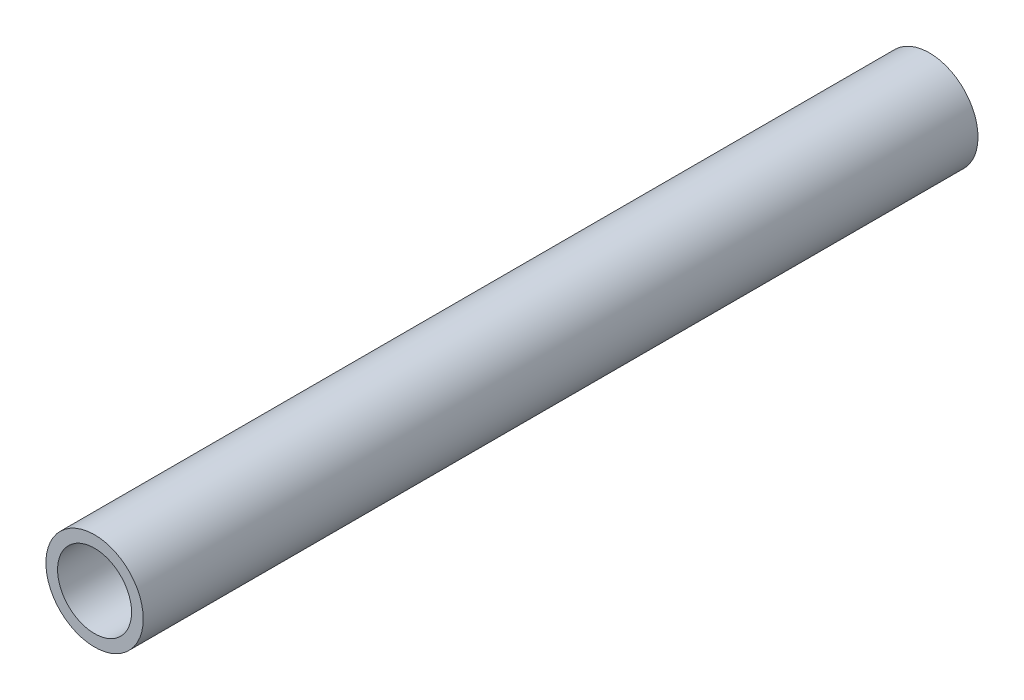
ISO-10303-21;
HEADER;
FILE_DESCRIPTION(('STEP AP214'),'2;1');
FILE_NAME('part.step','',(''),(''),'','','');
FILE_SCHEMA(('AUTOMOTIVE_DESIGN { 1 0 10303 214 1 1 1 1 }'));
ENDSEC;
DATA;
#1=APPLICATION_CONTEXT('core data for automotive mechanical design processes');
#2=APPLICATION_PROTOCOL_DEFINITION('international standard','automotive_design',2000,#1);
#3=PRODUCT_CONTEXT('',#1,'mechanical');
#4=PRODUCT('Part','Part','',(#3));
#5=PRODUCT_RELATED_PRODUCT_CATEGORY('part','',(#4));
#6=PRODUCT_DEFINITION_FORMATION('','',#4);
#7=PRODUCT_DEFINITION_CONTEXT('part definition',#1,'design');
#8=PRODUCT_DEFINITION('design','',#6,#7);
#9=PRODUCT_DEFINITION_SHAPE('','',#8);
#10=(LENGTH_UNIT() NAMED_UNIT(*) SI_UNIT(.MILLI.,.METRE.));
#11=(NAMED_UNIT(*) PLANE_ANGLE_UNIT() SI_UNIT($,.RADIAN.));
#12=(NAMED_UNIT(*) SI_UNIT($,.STERADIAN.) SOLID_ANGLE_UNIT());
#13=UNCERTAINTY_MEASURE_WITH_UNIT(LENGTH_MEASURE(1.E-05),#10,'distance_accuracy_value','');
#14=(GEOMETRIC_REPRESENTATION_CONTEXT(3) GLOBAL_UNCERTAINTY_ASSIGNED_CONTEXT((#13)) GLOBAL_UNIT_ASSIGNED_CONTEXT((#10,
#11,#12)) REPRESENTATION_CONTEXT('',''));
#15=CARTESIAN_POINT('',(0.,0.,0.));
#16=DIRECTION('',(0.,0.,1.));
#17=DIRECTION('',(1.,0.,0.));
#18=AXIS2_PLACEMENT_3D('',#15,#16,#17);
#19=CARTESIAN_POINT('',(0.,0.,286.512));
#20=DIRECTION('',(0.,0.,1.));
#21=DIRECTION('',(1.,0.,0.));
#22=AXIS2_PLACEMENT_3D('',#19,#20,#21);
#23=PLANE('',#22);
#24=CARTESIAN_POINT('',(0.,0.,286.512));
#25=DIRECTION('',(0.,0.,1.));
#26=DIRECTION('',(1.,0.,0.));
#27=AXIS2_PLACEMENT_3D('',#24,#25,#26);
#28=CIRCLE('',#27,16.7005);
#29=CARTESIAN_POINT('',(16.7005,0.,286.512));
#30=VERTEX_POINT('',#29);
#31=EDGE_CURVE('E11',#30,#30,#28,.T.);
#32=ORIENTED_EDGE('',*,*,#31,.T.);
#33=EDGE_LOOP('',(#32));
#34=FACE_BOUND('',#33,.T.);
#35=CARTESIAN_POINT('',(0.,0.,286.512));
#36=DIRECTION('',(0.,0.,1.));
#37=DIRECTION('',(1.,0.,0.));
#38=AXIS2_PLACEMENT_3D('',#35,#36,#37);
#39=CIRCLE('',#38,12.7);
#40=CARTESIAN_POINT('',(12.7,0.,286.512));
#41=VERTEX_POINT('',#40);
#42=EDGE_CURVE('E48',#41,#41,#39,.T.);
#43=ORIENTED_EDGE('',*,*,#42,.F.);
#44=EDGE_LOOP('',(#43));
#45=FACE_BOUND('',#44,.T.);
#46=ADVANCED_FACE('F37',(#34,#45),#23,.T.);
#47=CARTESIAN_POINT('',(0.,0.,0.));
#48=DIRECTION('',(0.,0.,1.));
#49=DIRECTION('',(1.,0.,0.));
#50=AXIS2_PLACEMENT_3D('',#47,#48,#49);
#51=PLANE('',#50);
#52=CARTESIAN_POINT('',(0.,0.,0.));
#53=DIRECTION('',(0.,0.,1.));
#54=DIRECTION('',(1.,0.,0.));
#55=AXIS2_PLACEMENT_3D('',#52,#53,#54);
#56=CIRCLE('',#55,16.7005);
#57=CARTESIAN_POINT('',(16.7005,0.,0.));
#58=VERTEX_POINT('',#57);
#59=EDGE_CURVE('E41',#58,#58,#56,.T.);
#60=ORIENTED_EDGE('',*,*,#59,.F.);
#61=EDGE_LOOP('',(#60));
#62=FACE_BOUND('',#61,.T.);
#63=CARTESIAN_POINT('',(0.,0.,0.));
#64=DIRECTION('',(0.,0.,1.));
#65=DIRECTION('',(1.,0.,0.));
#66=AXIS2_PLACEMENT_3D('',#63,#64,#65);
#67=CIRCLE('',#66,12.7);
#68=CARTESIAN_POINT('',(12.7,0.,0.));
#69=VERTEX_POINT('',#68);
#70=EDGE_CURVE('E50',#69,#69,#67,.T.);
#71=ORIENTED_EDGE('',*,*,#70,.T.);
#72=EDGE_LOOP('',(#71));
#73=FACE_BOUND('',#72,.T.);
#74=ADVANCED_FACE('F60',(#62,#73),#51,.F.);
#75=CARTESIAN_POINT('',(0.,0.,286.512));
#76=DIRECTION('',(0.,0.,-1.));
#77=DIRECTION('',(-1.,0.,0.));
#78=AXIS2_PLACEMENT_3D('',#75,#76,#77);
#79=CYLINDRICAL_SURFACE('',#78,16.7005);
#80=ORIENTED_EDGE('',*,*,#31,.F.);
#81=EDGE_LOOP('',(#80));
#82=FACE_BOUND('',#81,.T.);
#83=ORIENTED_EDGE('',*,*,#59,.T.);
#84=EDGE_LOOP('',(#83));
#85=FACE_BOUND('',#84,.T.);
#86=ADVANCED_FACE('F39',(#82,#85),#79,.T.);
#87=CARTESIAN_POINT('',(0.,0.,286.512));
#88=DIRECTION('',(0.,0.,-1.));
#89=DIRECTION('',(-1.,0.,0.));
#90=AXIS2_PLACEMENT_3D('',#87,#88,#89);
#91=CYLINDRICAL_SURFACE('',#90,12.7);
#92=ORIENTED_EDGE('',*,*,#42,.T.);
#93=EDGE_LOOP('',(#92));
#94=FACE_BOUND('',#93,.T.);
#95=ORIENTED_EDGE('',*,*,#70,.F.);
#96=EDGE_LOOP('',(#95));
#97=FACE_BOUND('',#96,.T.);
#98=ADVANCED_FACE('F56',(#94,#97),#91,.F.);
#99=CLOSED_SHELL('',(#46,#74,#86,#98));
#100=MANIFOLD_SOLID_BREP('B2',#99);
#101=ADVANCED_BREP_SHAPE_REPRESENTATION('',(#18,#100),#14);
#102=SHAPE_DEFINITION_REPRESENTATION(#9,#101);
ENDSEC;
END-ISO-10303-21;
